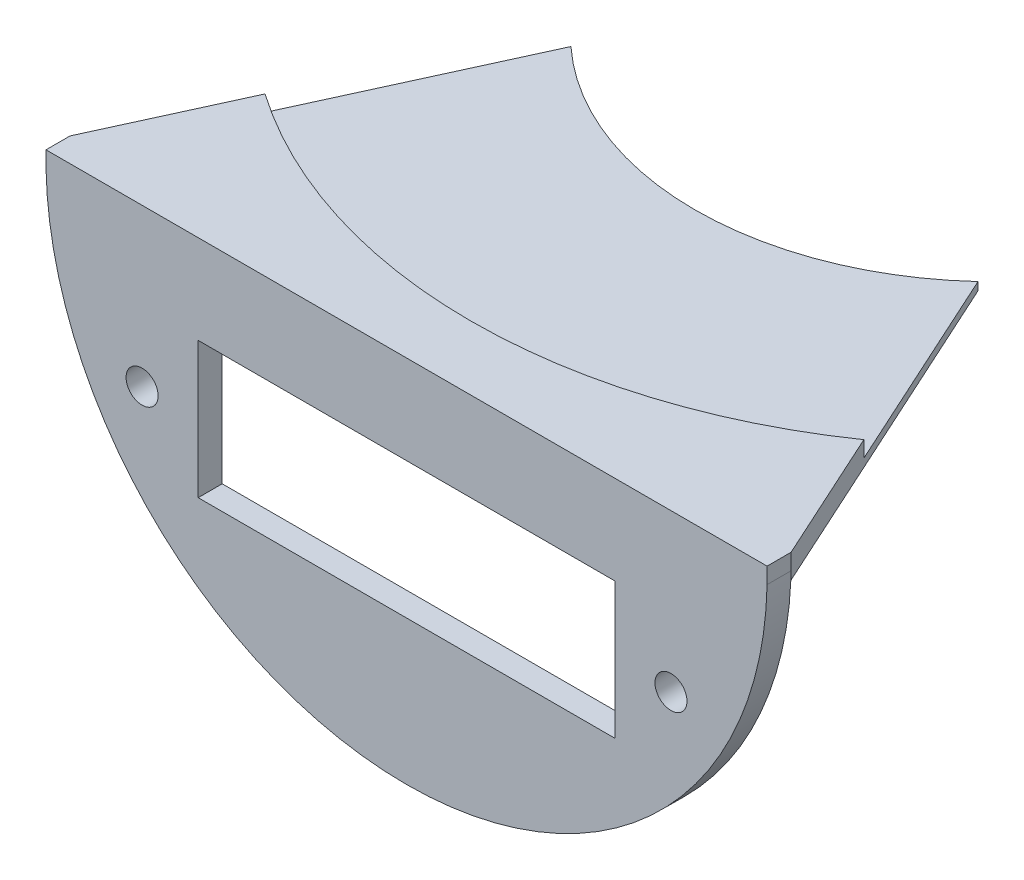
ISO-10303-21;
HEADER;
FILE_DESCRIPTION(('STEP AP214'),'2;1');
FILE_NAME('part.step','',(''),(''),'','','');
FILE_SCHEMA(('AUTOMOTIVE_DESIGN { 1 0 10303 214 1 1 1 1 }'));
ENDSEC;
DATA;
#1=APPLICATION_CONTEXT('core data for automotive mechanical design processes');
#2=APPLICATION_PROTOCOL_DEFINITION('international standard','automotive_design',2000,#1);
#3=PRODUCT_CONTEXT('',#1,'mechanical');
#4=PRODUCT('Part','Part','',(#3));
#5=PRODUCT_RELATED_PRODUCT_CATEGORY('part','',(#4));
#6=PRODUCT_DEFINITION_FORMATION('','',#4);
#7=PRODUCT_DEFINITION_CONTEXT('part definition',#1,'design');
#8=PRODUCT_DEFINITION('design','',#6,#7);
#9=PRODUCT_DEFINITION_SHAPE('','',#8);
#10=(LENGTH_UNIT() NAMED_UNIT(*) SI_UNIT(.MILLI.,.METRE.));
#11=(NAMED_UNIT(*) PLANE_ANGLE_UNIT() SI_UNIT($,.RADIAN.));
#12=(NAMED_UNIT(*) SI_UNIT($,.STERADIAN.) SOLID_ANGLE_UNIT());
#13=UNCERTAINTY_MEASURE_WITH_UNIT(LENGTH_MEASURE(1.E-05),#10,'distance_accuracy_value','');
#14=(GEOMETRIC_REPRESENTATION_CONTEXT(3) GLOBAL_UNCERTAINTY_ASSIGNED_CONTEXT((#13)) GLOBAL_UNIT_ASSIGNED_CONTEXT((#10,
#11,#12)) REPRESENTATION_CONTEXT('',''));
#15=CARTESIAN_POINT('',(0.,0.,0.));
#16=DIRECTION('',(0.,0.,1.));
#17=DIRECTION('',(1.,0.,0.));
#18=AXIS2_PLACEMENT_3D('',#15,#16,#17);
#19=CARTESIAN_POINT('',(-44.99099909982,29.1,3.));
#20=DIRECTION('',(0.,-1.,0.));
#21=DIRECTION('',(1.,0.,0.));
#22=AXIS2_PLACEMENT_3D('',#19,#20,#21);
#23=PLANE('',#22);
#24=CARTESIAN_POINT('',(0.,29.1,-70.5));
#25=DIRECTION('',(0.,-1.,0.));
#26=DIRECTION('',(-1.,0.,0.));
#27=AXIS2_PLACEMENT_3D('',#24,#25,#26);
#28=CIRCLE('',#27,65.5);
#29=CARTESIAN_POINT('',(37.3653111482014,29.1,-16.7033130871603));
#30=VERTEX_POINT('',#29);
#31=CARTESIAN_POINT('',(-37.3653111482014,29.1,-16.7033130871603));
#32=VERTEX_POINT('',#31);
#33=EDGE_CURVE('E51',#30,#32,#28,.T.);
#34=ORIENTED_EDGE('',*,*,#33,.F.);
#35=DIRECTION('',(0.415304176037508,0.,0.909682604739591));
#36=VECTOR('',#35,1.);
#37=CARTESIAN_POINT('',(25.4,29.1,-42.9121403512342));
#38=LINE('',#37,#36);
#39=CARTESIAN_POINT('',(25.4,29.1,-42.9121403512342));
#40=VERTEX_POINT('',#39);
#41=EDGE_CURVE('E167',#40,#30,#38,.T.);
#42=ORIENTED_EDGE('',*,*,#41,.F.);
#43=CARTESIAN_POINT('',(0.,29.1,-70.5));
#44=DIRECTION('',(0.,-1.,0.));
#45=DIRECTION('',(0.,0.,-1.));
#46=AXIS2_PLACEMENT_3D('',#43,#44,#45);
#47=CIRCLE('',#46,37.5);
#48=CARTESIAN_POINT('',(-25.4,29.1,-42.9121403512342));
#49=VERTEX_POINT('',#48);
#50=EDGE_CURVE('E166',#49,#40,#47,.F.);
#51=ORIENTED_EDGE('',*,*,#50,.F.);
#52=DIRECTION('',(0.415304176037507,0.,-0.909682604739591));
#53=VECTOR('',#52,1.);
#54=CARTESIAN_POINT('',(-25.4,29.1,-42.9121403512342));
#55=LINE('',#54,#53);
#56=EDGE_CURVE('E164',#32,#49,#55,.T.);
#57=ORIENTED_EDGE('',*,*,#56,.F.);
#58=EDGE_LOOP('',(#34,#42,#51,#57));
#59=FACE_BOUND('',#58,.T.);
#60=ADVANCED_FACE('F33',(#59),#23,.F.);
#61=CARTESIAN_POINT('',(0.,30.,3.));
#62=DIRECTION('',(0.,0.,1.));
#63=DIRECTION('',(1.,0.,0.));
#64=AXIS2_PLACEMENT_3D('',#61,#62,#63);
#65=PLANE('',#64);
#66=CARTESIAN_POINT('',(-33.,11.5,3.));
#67=DIRECTION('',(0.,0.,1.));
#68=DIRECTION('',(1.,0.,0.));
#69=AXIS2_PLACEMENT_3D('',#66,#67,#68);
#70=CIRCLE('',#69,2.);
#71=CARTESIAN_POINT('',(-31.,11.5,3.));
#72=VERTEX_POINT('',#71);
#73=EDGE_CURVE('E194',#72,#72,#70,.T.);
#74=ORIENTED_EDGE('',*,*,#73,.F.);
#75=EDGE_LOOP('',(#74));
#76=FACE_BOUND('',#75,.T.);
#77=CARTESIAN_POINT('',(0.,30.,3.));
#78=DIRECTION('',(0.,0.,1.));
#79=DIRECTION('',(1.,0.,0.));
#80=AXIS2_PLACEMENT_3D('',#77,#78,#79);
#81=CIRCLE('',#80,45.);
#82=CARTESIAN_POINT('',(-44.99099909982,29.1,3.));
#83=VERTEX_POINT('',#82);
#84=CARTESIAN_POINT('',(44.99099909982,29.1,3.));
#85=VERTEX_POINT('',#84);
#86=EDGE_CURVE('E231',#83,#85,#81,.T.);
#87=ORIENTED_EDGE('',*,*,#86,.T.);
#88=DIRECTION('',(0.,-1.,0.));
#89=VECTOR('',#88,1.);
#90=CARTESIAN_POINT('',(44.99099909982,31.1,3.));
#91=LINE('',#90,#89);
#92=CARTESIAN_POINT('',(44.99099909982,31.1,3.));
#93=VERTEX_POINT('',#92);
#94=EDGE_CURVE('E249',#93,#85,#91,.T.);
#95=ORIENTED_EDGE('',*,*,#94,.F.);
#96=DIRECTION('',(1.,0.,0.));
#97=VECTOR('',#96,1.);
#98=CARTESIAN_POINT('',(-44.99099909982,31.1,3.));
#99=LINE('',#98,#97);
#100=CARTESIAN_POINT('',(-44.99099909982,31.1,3.));
#101=VERTEX_POINT('',#100);
#102=EDGE_CURVE('E287',#101,#93,#99,.T.);
#103=ORIENTED_EDGE('',*,*,#102,.F.);
#104=DIRECTION('',(0.,-1.,0.));
#105=VECTOR('',#104,1.);
#106=CARTESIAN_POINT('',(-44.99099909982,31.1,3.));
#107=LINE('',#106,#105);
#108=EDGE_CURVE('E160',#101,#83,#107,.T.);
#109=ORIENTED_EDGE('',*,*,#108,.T.);
#110=EDGE_LOOP('',(#87,#95,#103,#109));
#111=FACE_BOUND('',#110,.T.);
#112=DIRECTION('',(1.,0.,0.));
#113=VECTOR('',#112,1.);
#114=CARTESIAN_POINT('',(-26.,2.99999999999999,3.));
#115=LINE('',#114,#113);
#116=CARTESIAN_POINT('',(-26.,2.99999999999999,3.));
#117=VERTEX_POINT('',#116);
#118=CARTESIAN_POINT('',(26.,2.99999999999999,3.));
#119=VERTEX_POINT('',#118);
#120=EDGE_CURVE('E202',#117,#119,#115,.T.);
#121=ORIENTED_EDGE('',*,*,#120,.F.);
#122=DIRECTION('',(0.,-1.,0.));
#123=VECTOR('',#122,1.);
#124=CARTESIAN_POINT('',(-26.,2.99999999999999,3.));
#125=LINE('',#124,#123);
#126=CARTESIAN_POINT('',(-26.,20.,3.));
#127=VERTEX_POINT('',#126);
#128=EDGE_CURVE('E200',#127,#117,#125,.T.);
#129=ORIENTED_EDGE('',*,*,#128,.F.);
#130=DIRECTION('',(-1.,0.,0.));
#131=VECTOR('',#130,1.);
#132=CARTESIAN_POINT('',(-26.,20.,3.));
#133=LINE('',#132,#131);
#134=CARTESIAN_POINT('',(26.,20.,3.));
#135=VERTEX_POINT('',#134);
#136=EDGE_CURVE('E208',#135,#127,#133,.T.);
#137=ORIENTED_EDGE('',*,*,#136,.F.);
#138=DIRECTION('',(0.,1.,0.));
#139=VECTOR('',#138,1.);
#140=CARTESIAN_POINT('',(26.,2.99999999999999,3.));
#141=LINE('',#140,#139);
#142=EDGE_CURVE('E205',#119,#135,#141,.T.);
#143=ORIENTED_EDGE('',*,*,#142,.F.);
#144=EDGE_LOOP('',(#121,#129,#137,#143));
#145=FACE_BOUND('',#144,.T.);
#146=CARTESIAN_POINT('',(33.,11.5,3.));
#147=DIRECTION('',(0.,0.,1.));
#148=DIRECTION('',(1.,0.,0.));
#149=AXIS2_PLACEMENT_3D('',#146,#147,#148);
#150=CIRCLE('',#149,2.);
#151=CARTESIAN_POINT('',(35.,11.5,3.));
#152=VERTEX_POINT('',#151);
#153=EDGE_CURVE('E188',#152,#152,#150,.T.);
#154=ORIENTED_EDGE('',*,*,#153,.F.);
#155=EDGE_LOOP('',(#154));
#156=FACE_BOUND('',#155,.T.);
#157=ADVANCED_FACE('F285',(#76,#111,#145,#156),#65,.T.);
#158=CARTESIAN_POINT('',(0.,30.,0.));
#159=DIRECTION('',(0.,0.,1.));
#160=DIRECTION('',(1.,0.,0.));
#161=AXIS2_PLACEMENT_3D('',#158,#159,#160);
#162=PLANE('',#161);
#163=CARTESIAN_POINT('',(0.,30.,0.));
#164=DIRECTION('',(0.,0.,1.));
#165=DIRECTION('',(1.,0.,0.));
#166=AXIS2_PLACEMENT_3D('',#163,#164,#165);
#167=CIRCLE('',#166,45.);
#168=CARTESIAN_POINT('',(-44.9598709962562,28.1,0.));
#169=VERTEX_POINT('',#168);
#170=CARTESIAN_POINT('',(44.9598709962562,28.1,0.));
#171=VERTEX_POINT('',#170);
#172=EDGE_CURVE('E237',#169,#171,#167,.T.);
#173=ORIENTED_EDGE('',*,*,#172,.F.);
#174=DIRECTION('',(1.,0.,0.));
#175=VECTOR('',#174,1.);
#176=CARTESIAN_POINT('',(44.99099909982,28.1,0.));
#177=LINE('',#176,#175);
#178=EDGE_CURVE('E11',#169,#171,#177,.T.);
#179=ORIENTED_EDGE('',*,*,#178,.T.);
#180=EDGE_LOOP('',(#173,#179));
#181=FACE_BOUND('',#180,.T.);
#182=DIRECTION('',(0.,-1.,0.));
#183=VECTOR('',#182,1.);
#184=CARTESIAN_POINT('',(-26.,2.99999999999999,0.));
#185=LINE('',#184,#183);
#186=CARTESIAN_POINT('',(-26.,20.,0.));
#187=VERTEX_POINT('',#186);
#188=CARTESIAN_POINT('',(-26.,2.99999999999999,0.));
#189=VERTEX_POINT('',#188);
#190=EDGE_CURVE('E197',#187,#189,#185,.T.);
#191=ORIENTED_EDGE('',*,*,#190,.T.);
#192=DIRECTION('',(1.,0.,0.));
#193=VECTOR('',#192,1.);
#194=CARTESIAN_POINT('',(-26.,2.99999999999999,0.));
#195=LINE('',#194,#193);
#196=CARTESIAN_POINT('',(26.,2.99999999999999,0.));
#197=VERTEX_POINT('',#196);
#198=EDGE_CURVE('E213',#189,#197,#195,.T.);
#199=ORIENTED_EDGE('',*,*,#198,.T.);
#200=DIRECTION('',(0.,1.,0.));
#201=VECTOR('',#200,1.);
#202=CARTESIAN_POINT('',(26.,2.99999999999999,0.));
#203=LINE('',#202,#201);
#204=CARTESIAN_POINT('',(26.,20.,0.));
#205=VERTEX_POINT('',#204);
#206=EDGE_CURVE('E216',#197,#205,#203,.T.);
#207=ORIENTED_EDGE('',*,*,#206,.T.);
#208=DIRECTION('',(-1.,0.,0.));
#209=VECTOR('',#208,1.);
#210=CARTESIAN_POINT('',(-26.,20.,0.));
#211=LINE('',#210,#209);
#212=EDGE_CURVE('E203',#205,#187,#211,.T.);
#213=ORIENTED_EDGE('',*,*,#212,.T.);
#214=EDGE_LOOP('',(#191,#199,#207,#213));
#215=FACE_BOUND('',#214,.T.);
#216=CARTESIAN_POINT('',(-33.,11.5,0.));
#217=DIRECTION('',(0.,0.,1.));
#218=DIRECTION('',(1.,0.,0.));
#219=AXIS2_PLACEMENT_3D('',#216,#217,#218);
#220=CIRCLE('',#219,2.);
#221=CARTESIAN_POINT('',(-31.,11.5,0.));
#222=VERTEX_POINT('',#221);
#223=EDGE_CURVE('E191',#222,#222,#220,.T.);
#224=ORIENTED_EDGE('',*,*,#223,.T.);
#225=EDGE_LOOP('',(#224));
#226=FACE_BOUND('',#225,.T.);
#227=CARTESIAN_POINT('',(33.,11.5,0.));
#228=DIRECTION('',(0.,0.,1.));
#229=DIRECTION('',(1.,0.,0.));
#230=AXIS2_PLACEMENT_3D('',#227,#228,#229);
#231=CIRCLE('',#230,2.);
#232=CARTESIAN_POINT('',(35.,11.5,0.));
#233=VERTEX_POINT('',#232);
#234=EDGE_CURVE('E169',#233,#233,#231,.T.);
#235=ORIENTED_EDGE('',*,*,#234,.T.);
#236=EDGE_LOOP('',(#235));
#237=FACE_BOUND('',#236,.T.);
#238=ADVANCED_FACE('F263',(#181,#215,#226,#237),#162,.F.);
#239=CARTESIAN_POINT('',(0.,30.,3.));
#240=DIRECTION('',(0.,0.,-1.));
#241=DIRECTION('',(-1.,0.,0.));
#242=AXIS2_PLACEMENT_3D('',#239,#240,#241);
#243=CYLINDRICAL_SURFACE('',#242,45.);
#244=CARTESIAN_POINT('',(-44.9909990998199,29.1,0.));
#245=VERTEX_POINT('',#244);
#246=EDGE_CURVE('E235',#245,#169,#167,.T.);
#247=ORIENTED_EDGE('',*,*,#246,.T.);
#248=ORIENTED_EDGE('',*,*,#172,.T.);
#249=CARTESIAN_POINT('',(44.99099909982,29.1,0.));
#250=VERTEX_POINT('',#249);
#251=EDGE_CURVE('E230',#171,#250,#167,.T.);
#252=ORIENTED_EDGE('',*,*,#251,.T.);
#253=DIRECTION('',(0.,0.,-1.));
#254=VECTOR('',#253,1.);
#255=CARTESIAN_POINT('',(44.99099909982,29.1,3.));
#256=LINE('',#255,#254);
#257=EDGE_CURVE('E37',#85,#250,#256,.T.);
#258=ORIENTED_EDGE('',*,*,#257,.F.);
#259=ORIENTED_EDGE('',*,*,#86,.F.);
#260=DIRECTION('',(0.,0.,-1.));
#261=VECTOR('',#260,1.);
#262=CARTESIAN_POINT('',(-44.99099909982,29.1,3.));
#263=LINE('',#262,#261);
#264=EDGE_CURVE('E234',#83,#245,#263,.T.);
#265=ORIENTED_EDGE('',*,*,#264,.T.);
#266=EDGE_LOOP('',(#247,#248,#252,#258,#259,#265));
#267=FACE_BOUND('',#266,.T.);
#268=ADVANCED_FACE('F35',(#267),#243,.T.);
#269=CARTESIAN_POINT('',(-26.,2.99999999999999,3.));
#270=DIRECTION('',(1.,0.,0.));
#271=DIRECTION('',(0.,0.,-1.));
#272=AXIS2_PLACEMENT_3D('',#269,#270,#271);
#273=PLANE('',#272);
#274=ORIENTED_EDGE('',*,*,#190,.F.);
#275=DIRECTION('',(0.,0.,-1.));
#276=VECTOR('',#275,1.);
#277=CARTESIAN_POINT('',(-26.,20.,3.));
#278=LINE('',#277,#276);
#279=EDGE_CURVE('E210',#127,#187,#278,.T.);
#280=ORIENTED_EDGE('',*,*,#279,.F.);
#281=ORIENTED_EDGE('',*,*,#128,.T.);
#282=DIRECTION('',(0.,0.,-1.));
#283=VECTOR('',#282,1.);
#284=CARTESIAN_POINT('',(-26.,2.99999999999999,3.));
#285=LINE('',#284,#283);
#286=EDGE_CURVE('E227',#117,#189,#285,.T.);
#287=ORIENTED_EDGE('',*,*,#286,.T.);
#288=EDGE_LOOP('',(#274,#280,#281,#287));
#289=FACE_BOUND('',#288,.T.);
#290=ADVANCED_FACE('F310',(#289),#273,.T.);
#291=CARTESIAN_POINT('',(-26.,2.99999999999999,3.));
#292=DIRECTION('',(0.,1.,0.));
#293=DIRECTION('',(0.,0.,1.));
#294=AXIS2_PLACEMENT_3D('',#291,#292,#293);
#295=PLANE('',#294);
#296=ORIENTED_EDGE('',*,*,#198,.F.);
#297=ORIENTED_EDGE('',*,*,#286,.F.);
#298=ORIENTED_EDGE('',*,*,#120,.T.);
#299=DIRECTION('',(0.,0.,-1.));
#300=VECTOR('',#299,1.);
#301=CARTESIAN_POINT('',(26.,2.99999999999999,3.));
#302=LINE('',#301,#300);
#303=EDGE_CURVE('E225',#119,#197,#302,.T.);
#304=ORIENTED_EDGE('',*,*,#303,.T.);
#305=EDGE_LOOP('',(#296,#297,#298,#304));
#306=FACE_BOUND('',#305,.T.);
#307=ADVANCED_FACE('F313',(#306),#295,.T.);
#308=CARTESIAN_POINT('',(26.,2.99999999999999,3.));
#309=DIRECTION('',(-1.,0.,0.));
#310=DIRECTION('',(0.,0.,1.));
#311=AXIS2_PLACEMENT_3D('',#308,#309,#310);
#312=PLANE('',#311);
#313=ORIENTED_EDGE('',*,*,#206,.F.);
#314=ORIENTED_EDGE('',*,*,#303,.F.);
#315=ORIENTED_EDGE('',*,*,#142,.T.);
#316=DIRECTION('',(0.,0.,-1.));
#317=VECTOR('',#316,1.);
#318=CARTESIAN_POINT('',(26.,20.,3.));
#319=LINE('',#318,#317);
#320=EDGE_CURVE('E223',#135,#205,#319,.T.);
#321=ORIENTED_EDGE('',*,*,#320,.T.);
#322=EDGE_LOOP('',(#313,#314,#315,#321));
#323=FACE_BOUND('',#322,.T.);
#324=ADVANCED_FACE('F317',(#323),#312,.T.);
#325=CARTESIAN_POINT('',(-26.,20.,3.));
#326=DIRECTION('',(0.,-1.,0.));
#327=DIRECTION('',(0.,0.,-1.));
#328=AXIS2_PLACEMENT_3D('',#325,#326,#327);
#329=PLANE('',#328);
#330=ORIENTED_EDGE('',*,*,#212,.F.);
#331=ORIENTED_EDGE('',*,*,#320,.F.);
#332=ORIENTED_EDGE('',*,*,#136,.T.);
#333=ORIENTED_EDGE('',*,*,#279,.T.);
#334=EDGE_LOOP('',(#330,#331,#332,#333));
#335=FACE_BOUND('',#334,.T.);
#336=ADVANCED_FACE('F321',(#335),#329,.T.);
#337=CARTESIAN_POINT('',(-33.,11.5,3.));
#338=DIRECTION('',(0.,0.,-1.));
#339=DIRECTION('',(-1.,0.,0.));
#340=AXIS2_PLACEMENT_3D('',#337,#338,#339);
#341=CYLINDRICAL_SURFACE('',#340,2.);
#342=ORIENTED_EDGE('',*,*,#73,.T.);
#343=EDGE_LOOP('',(#342));
#344=FACE_BOUND('',#343,.T.);
#345=ORIENTED_EDGE('',*,*,#223,.F.);
#346=EDGE_LOOP('',(#345));
#347=FACE_BOUND('',#346,.T.);
#348=ADVANCED_FACE('F325',(#344,#347),#341,.F.);
#349=CARTESIAN_POINT('',(33.,11.5,3.));
#350=DIRECTION('',(0.,0.,-1.));
#351=DIRECTION('',(-1.,0.,0.));
#352=AXIS2_PLACEMENT_3D('',#349,#350,#351);
#353=CYLINDRICAL_SURFACE('',#352,2.);
#354=ORIENTED_EDGE('',*,*,#153,.T.);
#355=EDGE_LOOP('',(#354));
#356=FACE_BOUND('',#355,.T.);
#357=ORIENTED_EDGE('',*,*,#234,.F.);
#358=EDGE_LOOP('',(#357));
#359=FACE_BOUND('',#358,.T.);
#360=ADVANCED_FACE('F329',(#356,#359),#353,.F.);
#361=CARTESIAN_POINT('',(44.99099909982,128.790580244695,0.));
#362=DIRECTION('',(0.,0.,-1.));
#363=DIRECTION('',(0.,1.,0.));
#364=AXIS2_PLACEMENT_3D('',#361,#362,#363);
#365=PLANE('',#364);
#366=ORIENTED_EDGE('',*,*,#246,.F.);
#367=DIRECTION('',(0.,-1.,0.));
#368=VECTOR('',#367,1.);
#369=CARTESIAN_POINT('',(-44.99099909982,128.790580244695,0.));
#370=LINE('',#369,#368);
#371=CARTESIAN_POINT('',(-44.99099909982,28.1,0.));
#372=VERTEX_POINT('',#371);
#373=EDGE_CURVE('E182',#245,#372,#370,.T.);
#374=ORIENTED_EDGE('',*,*,#373,.T.);
#375=EDGE_CURVE('E43',#372,#169,#177,.T.);
#376=ORIENTED_EDGE('',*,*,#375,.T.);
#377=EDGE_LOOP('',(#366,#374,#376));
#378=FACE_BOUND('',#377,.T.);
#379=ADVANCED_FACE('F270',(#378),#365,.F.);
#380=CARTESIAN_POINT('',(0.,28.1,-70.5));
#381=DIRECTION('',(0.,-1.,0.));
#382=DIRECTION('',(1.,0.,0.));
#383=AXIS2_PLACEMENT_3D('',#380,#381,#382);
#384=PLANE('',#383);
#385=CARTESIAN_POINT('',(0.,28.1,-70.5));
#386=DIRECTION('',(0.,-1.,0.));
#387=DIRECTION('',(1.,0.,0.));
#388=AXIS2_PLACEMENT_3D('',#385,#386,#387);
#389=CIRCLE('',#388,37.5);
#390=CARTESIAN_POINT('',(25.4,28.1,-42.9121403512342));
#391=VERTEX_POINT('',#390);
#392=CARTESIAN_POINT('',(-25.4,28.1,-42.9121403512342));
#393=VERTEX_POINT('',#392);
#394=EDGE_CURVE('E155',#391,#393,#389,.T.);
#395=ORIENTED_EDGE('',*,*,#394,.F.);
#396=DIRECTION('',(-0.415304176037508,0.,-0.909682604739591));
#397=VECTOR('',#396,1.);
#398=CARTESIAN_POINT('',(25.4,28.1,-42.9121403512342));
#399=LINE('',#398,#397);
#400=CARTESIAN_POINT('',(44.99099909982,28.1,0.));
#401=VERTEX_POINT('',#400);
#402=EDGE_CURVE('E174',#401,#391,#399,.T.);
#403=ORIENTED_EDGE('',*,*,#402,.F.);
#404=EDGE_CURVE('E44',#171,#401,#177,.T.);
#405=ORIENTED_EDGE('',*,*,#404,.F.);
#406=ORIENTED_EDGE('',*,*,#178,.F.);
#407=ORIENTED_EDGE('',*,*,#375,.F.);
#408=DIRECTION('',(-0.415304176037507,0.,0.909682604739591));
#409=VECTOR('',#408,1.);
#410=CARTESIAN_POINT('',(-25.4,28.1,-42.9121403512342));
#411=LINE('',#410,#409);
#412=EDGE_CURVE('E158',#393,#372,#411,.T.);
#413=ORIENTED_EDGE('',*,*,#412,.F.);
#414=EDGE_LOOP('',(#395,#403,#405,#406,#407,#413));
#415=FACE_BOUND('',#414,.T.);
#416=ADVANCED_FACE('F267',(#415),#384,.T.);
#417=CARTESIAN_POINT('',(25.4,128.790580244695,-42.9121403512342));
#418=DIRECTION('',(-0.909682604739591,0.,0.415304176037508));
#419=DIRECTION('',(0.415304176037508,0.,0.909682604739591));
#420=AXIS2_PLACEMENT_3D('',#417,#418,#419);
#421=PLANE('',#420);
#422=DIRECTION('',(0.,-1.,0.));
#423=VECTOR('',#422,1.);
#424=CARTESIAN_POINT('',(25.4,128.790580244695,-42.9121403512342));
#425=LINE('',#424,#423);
#426=EDGE_CURVE('E177',#40,#391,#425,.T.);
#427=ORIENTED_EDGE('',*,*,#426,.F.);
#428=ORIENTED_EDGE('',*,*,#41,.T.);
#429=DIRECTION('',(0.,-1.,0.));
#430=VECTOR('',#429,1.);
#431=CARTESIAN_POINT('',(37.3653111482014,31.1,-16.7033130871603));
#432=LINE('',#431,#430);
#433=CARTESIAN_POINT('',(37.3653111482014,31.1,-16.7033130871603));
#434=VERTEX_POINT('',#433);
#435=EDGE_CURVE('E255',#434,#30,#432,.T.);
#436=ORIENTED_EDGE('',*,*,#435,.F.);
#437=DIRECTION('',(-0.415304176037508,0.,-0.909682604739591));
#438=VECTOR('',#437,1.);
#439=CARTESIAN_POINT('',(44.99099909982,31.1,0.));
#440=LINE('',#439,#438);
#441=CARTESIAN_POINT('',(44.99099909982,31.1,0.));
#442=VERTEX_POINT('',#441);
#443=EDGE_CURVE('E151',#442,#434,#440,.T.);
#444=ORIENTED_EDGE('',*,*,#443,.F.);
#445=DIRECTION('',(0.,-1.,0.));
#446=VECTOR('',#445,1.);
#447=CARTESIAN_POINT('',(44.99099909982,31.1,0.));
#448=LINE('',#447,#446);
#449=EDGE_CURVE('E247',#442,#250,#448,.T.);
#450=ORIENTED_EDGE('',*,*,#449,.T.);
#451=DIRECTION('',(0.,-1.,0.));
#452=VECTOR('',#451,1.);
#453=CARTESIAN_POINT('',(44.99099909982,128.790580244695,0.));
#454=LINE('',#453,#452);
#455=EDGE_CURVE('E179',#250,#401,#454,.T.);
#456=ORIENTED_EDGE('',*,*,#455,.T.);
#457=ORIENTED_EDGE('',*,*,#402,.T.);
#458=EDGE_LOOP('',(#427,#428,#436,#444,#450,#456,#457));
#459=FACE_BOUND('',#458,.T.);
#460=ADVANCED_FACE('F254',(#459),#421,.F.);
#461=ORIENTED_EDGE('',*,*,#251,.F.);
#462=ORIENTED_EDGE('',*,*,#404,.T.);
#463=ORIENTED_EDGE('',*,*,#455,.F.);
#464=EDGE_LOOP('',(#461,#462,#463));
#465=FACE_BOUND('',#464,.T.);
#466=ADVANCED_FACE('F258',(#465),#365,.F.);
#467=CARTESIAN_POINT('',(-25.4,128.790580244695,-42.9121403512342));
#468=DIRECTION('',(0.909682604739591,0.,0.415304176037507));
#469=DIRECTION('',(0.415304176037507,0.,-0.909682604739591));
#470=AXIS2_PLACEMENT_3D('',#467,#468,#469);
#471=PLANE('',#470);
#472=ORIENTED_EDGE('',*,*,#373,.F.);
#473=DIRECTION('',(0.,-1.,0.));
#474=VECTOR('',#473,1.);
#475=CARTESIAN_POINT('',(-44.9909990998199,31.1,0.));
#476=LINE('',#475,#474);
#477=CARTESIAN_POINT('',(-44.9909990998199,31.1,0.));
#478=VERTEX_POINT('',#477);
#479=EDGE_CURVE('E142',#478,#245,#476,.T.);
#480=ORIENTED_EDGE('',*,*,#479,.F.);
#481=DIRECTION('',(-0.415304176037507,0.,0.909682604739591));
#482=VECTOR('',#481,1.);
#483=CARTESIAN_POINT('',(-37.3653111482015,31.1,-16.7033130871603));
#484=LINE('',#483,#482);
#485=CARTESIAN_POINT('',(-37.3653111482015,31.1,-16.7033130871603));
#486=VERTEX_POINT('',#485);
#487=EDGE_CURVE('E136',#486,#478,#484,.T.);
#488=ORIENTED_EDGE('',*,*,#487,.F.);
#489=DIRECTION('',(0.,-1.,0.));
#490=VECTOR('',#489,1.);
#491=CARTESIAN_POINT('',(-37.3653111482015,31.1,-16.7033130871603));
#492=LINE('',#491,#490);
#493=EDGE_CURVE('E140',#486,#32,#492,.T.);
#494=ORIENTED_EDGE('',*,*,#493,.T.);
#495=ORIENTED_EDGE('',*,*,#56,.T.);
#496=DIRECTION('',(0.,-1.,0.));
#497=VECTOR('',#496,1.);
#498=CARTESIAN_POINT('',(-25.4,128.790580244695,-42.9121403512342));
#499=LINE('',#498,#497);
#500=EDGE_CURVE('E184',#49,#393,#499,.T.);
#501=ORIENTED_EDGE('',*,*,#500,.T.);
#502=ORIENTED_EDGE('',*,*,#412,.T.);
#503=EDGE_LOOP('',(#472,#480,#488,#494,#495,#501,#502));
#504=FACE_BOUND('',#503,.T.);
#505=ADVANCED_FACE('F139',(#504),#471,.F.);
#506=CARTESIAN_POINT('',(0.,128.790580244695,-70.5));
#507=DIRECTION('',(0.,-1.,0.));
#508=DIRECTION('',(1.,0.,0.));
#509=AXIS2_PLACEMENT_3D('',#506,#507,#508);
#510=CYLINDRICAL_SURFACE('',#509,37.5);
#511=ORIENTED_EDGE('',*,*,#500,.F.);
#512=ORIENTED_EDGE('',*,*,#50,.T.);
#513=ORIENTED_EDGE('',*,*,#426,.T.);
#514=ORIENTED_EDGE('',*,*,#394,.T.);
#515=EDGE_LOOP('',(#511,#512,#513,#514));
#516=FACE_BOUND('',#515,.T.);
#517=ADVANCED_FACE('F273',(#516),#510,.F.);
#518=CARTESIAN_POINT('',(0.,31.1,-70.5));
#519=DIRECTION('',(0.,-1.,0.));
#520=DIRECTION('',(1.,0.,0.));
#521=AXIS2_PLACEMENT_3D('',#518,#519,#520);
#522=CYLINDRICAL_SURFACE('',#521,65.5);
#523=ORIENTED_EDGE('',*,*,#33,.T.);
#524=ORIENTED_EDGE('',*,*,#493,.F.);
#525=CARTESIAN_POINT('',(0.,31.1,-70.5));
#526=DIRECTION('',(0.,-1.,0.));
#527=DIRECTION('',(-1.,0.,0.));
#528=AXIS2_PLACEMENT_3D('',#525,#526,#527);
#529=CIRCLE('',#528,65.5);
#530=EDGE_CURVE('E146',#434,#486,#529,.T.);
#531=ORIENTED_EDGE('',*,*,#530,.F.);
#532=ORIENTED_EDGE('',*,*,#435,.T.);
#533=EDGE_LOOP('',(#523,#524,#531,#532));
#534=FACE_BOUND('',#533,.T.);
#535=ADVANCED_FACE('F154',(#534),#522,.F.);
#536=CARTESIAN_POINT('',(-44.9909990998199,31.1,0.));
#537=DIRECTION('',(1.,0.,0.));
#538=DIRECTION('',(0.,0.,-1.));
#539=AXIS2_PLACEMENT_3D('',#536,#537,#538);
#540=PLANE('',#539);
#541=ORIENTED_EDGE('',*,*,#264,.F.);
#542=ORIENTED_EDGE('',*,*,#108,.F.);
#543=DIRECTION('',(0.,0.,1.));
#544=VECTOR('',#543,1.);
#545=CARTESIAN_POINT('',(-44.9909990998199,31.1,0.));
#546=LINE('',#545,#544);
#547=EDGE_CURVE('E145',#478,#101,#546,.T.);
#548=ORIENTED_EDGE('',*,*,#547,.F.);
#549=ORIENTED_EDGE('',*,*,#479,.T.);
#550=EDGE_LOOP('',(#541,#542,#548,#549));
#551=FACE_BOUND('',#550,.T.);
#552=ADVANCED_FACE('F289',(#551),#540,.F.);
#553=CARTESIAN_POINT('',(44.99099909982,31.1,3.));
#554=DIRECTION('',(-1.,0.,0.));
#555=DIRECTION('',(0.,-1.,0.));
#556=AXIS2_PLACEMENT_3D('',#553,#554,#555);
#557=PLANE('',#556);
#558=ORIENTED_EDGE('',*,*,#257,.T.);
#559=ORIENTED_EDGE('',*,*,#449,.F.);
#560=DIRECTION('',(0.,0.,-1.));
#561=VECTOR('',#560,1.);
#562=CARTESIAN_POINT('',(44.99099909982,31.1,3.));
#563=LINE('',#562,#561);
#564=EDGE_CURVE('E291',#93,#442,#563,.T.);
#565=ORIENTED_EDGE('',*,*,#564,.F.);
#566=ORIENTED_EDGE('',*,*,#94,.T.);
#567=EDGE_LOOP('',(#558,#559,#565,#566));
#568=FACE_BOUND('',#567,.T.);
#569=ADVANCED_FACE('F245',(#568),#557,.F.);
#570=CARTESIAN_POINT('',(0.,31.1,-70.5));
#571=DIRECTION('',(0.,1.,0.));
#572=DIRECTION('',(-1.,0.,0.));
#573=AXIS2_PLACEMENT_3D('',#570,#571,#572);
#574=PLANE('',#573);
#575=ORIENTED_EDGE('',*,*,#530,.T.);
#576=ORIENTED_EDGE('',*,*,#487,.T.);
#577=ORIENTED_EDGE('',*,*,#547,.T.);
#578=ORIENTED_EDGE('',*,*,#102,.T.);
#579=ORIENTED_EDGE('',*,*,#564,.T.);
#580=ORIENTED_EDGE('',*,*,#443,.T.);
#581=EDGE_LOOP('',(#575,#576,#577,#578,#579,#580));
#582=FACE_BOUND('',#581,.T.);
#583=ADVANCED_FACE('F149',(#582),#574,.T.);
#584=CLOSED_SHELL('',(#60,#157,#238,#268,#290,#307,#324,#336,#348,#360,#379,#416,#460,#466,#505,
#517,#535,#552,#569,#583));
#585=MANIFOLD_SOLID_BREP('B2',#584);
#586=ADVANCED_BREP_SHAPE_REPRESENTATION('',(#18,#585),#14);
#587=SHAPE_DEFINITION_REPRESENTATION(#9,#586);
ENDSEC;
END-ISO-10303-21;
